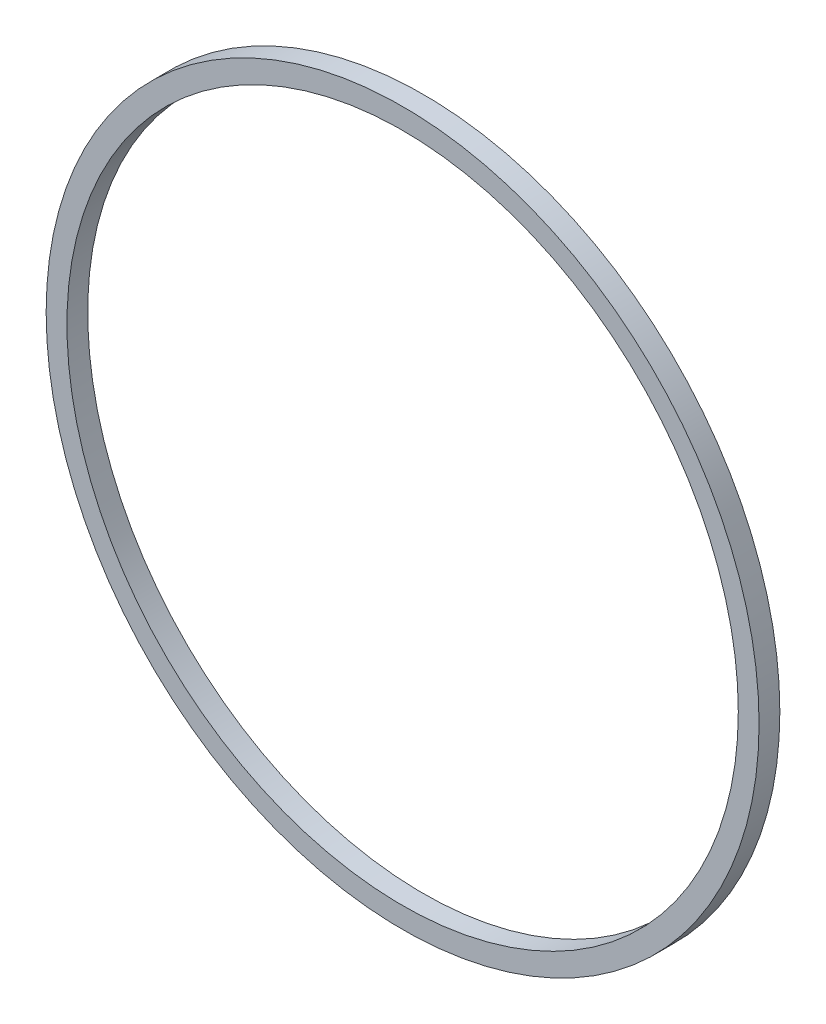
ISO-10303-21;
HEADER;
FILE_DESCRIPTION(('STEP AP214'),'2;1');
FILE_NAME('part.step','',(''),(''),'','','');
FILE_SCHEMA(('AUTOMOTIVE_DESIGN { 1 0 10303 214 1 1 1 1 }'));
ENDSEC;
DATA;
#1=APPLICATION_CONTEXT('core data for automotive mechanical design processes');
#2=APPLICATION_PROTOCOL_DEFINITION('international standard','automotive_design',2000,#1);
#3=PRODUCT_CONTEXT('',#1,'mechanical');
#4=PRODUCT('Part','Part','',(#3));
#5=PRODUCT_RELATED_PRODUCT_CATEGORY('part','',(#4));
#6=PRODUCT_DEFINITION_FORMATION('','',#4);
#7=PRODUCT_DEFINITION_CONTEXT('part definition',#1,'design');
#8=PRODUCT_DEFINITION('design','',#6,#7);
#9=PRODUCT_DEFINITION_SHAPE('','',#8);
#10=(LENGTH_UNIT() NAMED_UNIT(*) SI_UNIT(.MILLI.,.METRE.));
#11=(NAMED_UNIT(*) PLANE_ANGLE_UNIT() SI_UNIT($,.RADIAN.));
#12=(NAMED_UNIT(*) SI_UNIT($,.STERADIAN.) SOLID_ANGLE_UNIT());
#13=UNCERTAINTY_MEASURE_WITH_UNIT(LENGTH_MEASURE(1.E-05),#10,'distance_accuracy_value','');
#14=(GEOMETRIC_REPRESENTATION_CONTEXT(3) GLOBAL_UNCERTAINTY_ASSIGNED_CONTEXT((#13)) GLOBAL_UNIT_ASSIGNED_CONTEXT((#10,
#11,#12)) REPRESENTATION_CONTEXT('',''));
#15=CARTESIAN_POINT('',(0.,0.,0.));
#16=DIRECTION('',(0.,0.,1.));
#17=DIRECTION('',(1.,0.,0.));
#18=AXIS2_PLACEMENT_3D('',#15,#16,#17);
#19=CARTESIAN_POINT('',(0.,0.,1.778));
#20=DIRECTION('',(0.,0.,1.));
#21=DIRECTION('',(1.,0.,0.));
#22=AXIS2_PLACEMENT_3D('',#19,#20,#21);
#23=PLANE('',#22);
#24=CARTESIAN_POINT('',(0.,0.,1.778));
#25=DIRECTION('',(0.,0.,1.));
#26=DIRECTION('',(1.,0.,0.));
#27=AXIS2_PLACEMENT_3D('',#24,#25,#26);
#28=CIRCLE('',#27,30.5054);
#29=CARTESIAN_POINT('',(30.5054,0.,1.778));
#30=VERTEX_POINT('',#29);
#31=EDGE_CURVE('E10',#30,#30,#28,.T.);
#32=ORIENTED_EDGE('',*,*,#31,.T.);
#33=EDGE_LOOP('',(#32));
#34=FACE_BOUND('',#33,.T.);
#35=CARTESIAN_POINT('',(0.,0.,1.778));
#36=DIRECTION('',(0.,0.,1.));
#37=DIRECTION('',(1.,0.,0.));
#38=AXIS2_PLACEMENT_3D('',#35,#36,#37);
#39=CIRCLE('',#38,28.7274);
#40=CARTESIAN_POINT('',(28.7274,0.,1.778));
#41=VERTEX_POINT('',#40);
#42=EDGE_CURVE('E42',#41,#41,#39,.T.);
#43=ORIENTED_EDGE('',*,*,#42,.F.);
#44=EDGE_LOOP('',(#43));
#45=FACE_BOUND('',#44,.T.);
#46=ADVANCED_FACE('F31',(#34,#45),#23,.T.);
#47=CARTESIAN_POINT('',(0.,0.,0.));
#48=DIRECTION('',(0.,0.,1.));
#49=DIRECTION('',(1.,0.,0.));
#50=AXIS2_PLACEMENT_3D('',#47,#48,#49);
#51=PLANE('',#50);
#52=CARTESIAN_POINT('',(0.,0.,0.));
#53=DIRECTION('',(0.,0.,1.));
#54=DIRECTION('',(1.,0.,0.));
#55=AXIS2_PLACEMENT_3D('',#52,#53,#54);
#56=CIRCLE('',#55,30.5054);
#57=CARTESIAN_POINT('',(30.5054,0.,0.));
#58=VERTEX_POINT('',#57);
#59=EDGE_CURVE('E35',#58,#58,#56,.T.);
#60=ORIENTED_EDGE('',*,*,#59,.F.);
#61=EDGE_LOOP('',(#60));
#62=FACE_BOUND('',#61,.T.);
#63=CARTESIAN_POINT('',(0.,0.,0.));
#64=DIRECTION('',(0.,0.,1.));
#65=DIRECTION('',(1.,0.,0.));
#66=AXIS2_PLACEMENT_3D('',#63,#64,#65);
#67=CIRCLE('',#66,28.7274);
#68=CARTESIAN_POINT('',(28.7274,0.,0.));
#69=VERTEX_POINT('',#68);
#70=EDGE_CURVE('E44',#69,#69,#67,.T.);
#71=ORIENTED_EDGE('',*,*,#70,.T.);
#72=EDGE_LOOP('',(#71));
#73=FACE_BOUND('',#72,.T.);
#74=ADVANCED_FACE('F54',(#62,#73),#51,.F.);
#75=CARTESIAN_POINT('',(0.,0.,1.778));
#76=DIRECTION('',(0.,0.,-1.));
#77=DIRECTION('',(-1.,0.,0.));
#78=AXIS2_PLACEMENT_3D('',#75,#76,#77);
#79=CYLINDRICAL_SURFACE('',#78,30.5054);
#80=ORIENTED_EDGE('',*,*,#31,.F.);
#81=EDGE_LOOP('',(#80));
#82=FACE_BOUND('',#81,.T.);
#83=ORIENTED_EDGE('',*,*,#59,.T.);
#84=EDGE_LOOP('',(#83));
#85=FACE_BOUND('',#84,.T.);
#86=ADVANCED_FACE('F33',(#82,#85),#79,.T.);
#87=CARTESIAN_POINT('',(0.,0.,1.778));
#88=DIRECTION('',(0.,0.,-1.));
#89=DIRECTION('',(-1.,0.,0.));
#90=AXIS2_PLACEMENT_3D('',#87,#88,#89);
#91=CYLINDRICAL_SURFACE('',#90,28.7274);
#92=ORIENTED_EDGE('',*,*,#42,.T.);
#93=EDGE_LOOP('',(#92));
#94=FACE_BOUND('',#93,.T.);
#95=ORIENTED_EDGE('',*,*,#70,.F.);
#96=EDGE_LOOP('',(#95));
#97=FACE_BOUND('',#96,.T.);
#98=ADVANCED_FACE('F50',(#94,#97),#91,.F.);
#99=CLOSED_SHELL('',(#46,#74,#86,#98));
#100=MANIFOLD_SOLID_BREP('B2',#99);
#101=ADVANCED_BREP_SHAPE_REPRESENTATION('',(#18,#100),#14);
#102=SHAPE_DEFINITION_REPRESENTATION(#9,#101);
ENDSEC;
END-ISO-10303-21;
